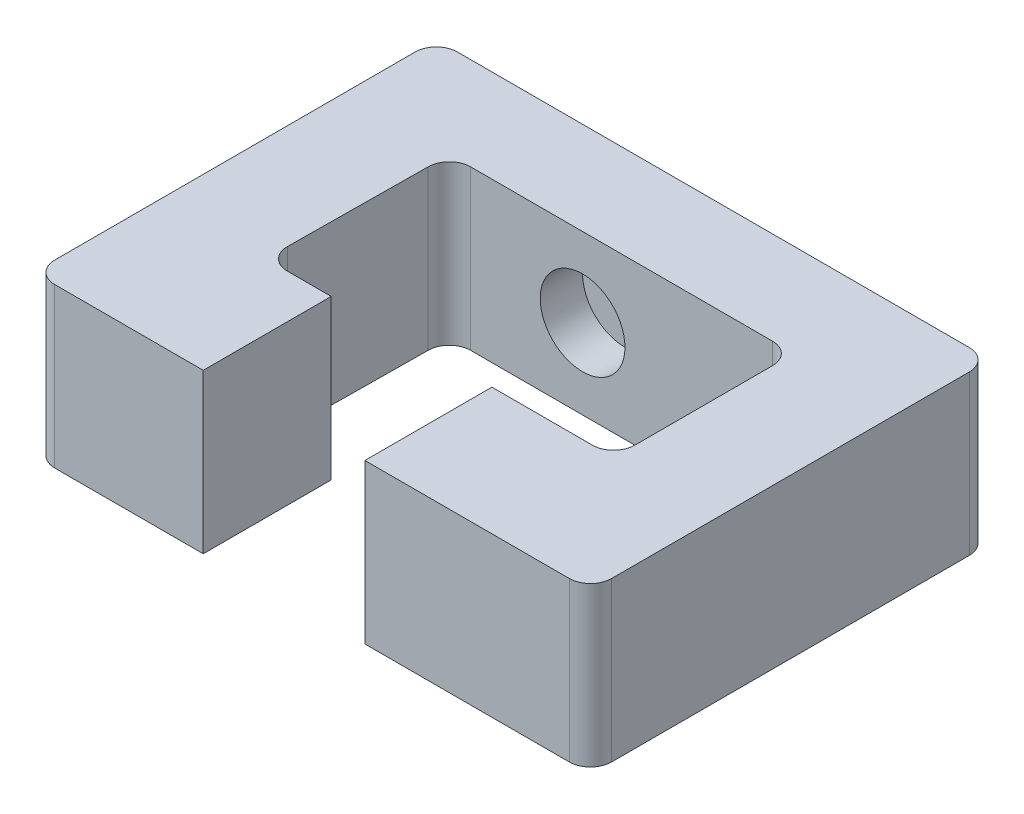
ISO-10303-21;
HEADER;
FILE_DESCRIPTION(('STEP AP214'),'2;1');
FILE_NAME('part.step','',(''),(''),'','','');
FILE_SCHEMA(('AUTOMOTIVE_DESIGN { 1 0 10303 214 1 1 1 1 }'));
ENDSEC;
DATA;
#1=APPLICATION_CONTEXT('core data for automotive mechanical design processes');
#2=APPLICATION_PROTOCOL_DEFINITION('international standard','automotive_design',2000,#1);
#3=PRODUCT_CONTEXT('',#1,'mechanical');
#4=PRODUCT('Part','Part','',(#3));
#5=PRODUCT_RELATED_PRODUCT_CATEGORY('part','',(#4));
#6=PRODUCT_DEFINITION_FORMATION('','',#4);
#7=PRODUCT_DEFINITION_CONTEXT('part definition',#1,'design');
#8=PRODUCT_DEFINITION('design','',#6,#7);
#9=PRODUCT_DEFINITION_SHAPE('','',#8);
#10=(LENGTH_UNIT() NAMED_UNIT(*) SI_UNIT(.MILLI.,.METRE.));
#11=(NAMED_UNIT(*) PLANE_ANGLE_UNIT() SI_UNIT($,.RADIAN.));
#12=(NAMED_UNIT(*) SI_UNIT($,.STERADIAN.) SOLID_ANGLE_UNIT());
#13=UNCERTAINTY_MEASURE_WITH_UNIT(LENGTH_MEASURE(1.E-05),#10,'distance_accuracy_value','');
#14=(GEOMETRIC_REPRESENTATION_CONTEXT(3) GLOBAL_UNCERTAINTY_ASSIGNED_CONTEXT((#13)) GLOBAL_UNIT_ASSIGNED_CONTEXT((#10,
#11,#12)) REPRESENTATION_CONTEXT('',''));
#15=CARTESIAN_POINT('',(0.,0.,0.));
#16=DIRECTION('',(0.,0.,1.));
#17=DIRECTION('',(1.,0.,0.));
#18=AXIS2_PLACEMENT_3D('',#15,#16,#17);
#19=CARTESIAN_POINT('',(11.2974538594039,15.,-15.5700064172726));
#20=DIRECTION('',(0.,-1.,0.));
#21=DIRECTION('',(0.,0.,-1.));
#22=AXIS2_PLACEMENT_3D('',#19,#20,#21);
#23=CYLINDRICAL_SURFACE('',#22,2.);
#24=CARTESIAN_POINT('',(11.2974538594039,0.,-15.5700064172726));
#25=DIRECTION('',(0.,1.,0.));
#26=DIRECTION('',(0.,0.,1.));
#27=AXIS2_PLACEMENT_3D('',#24,#25,#26);
#28=CIRCLE('',#27,2.);
#29=CARTESIAN_POINT('',(13.2974538594039,0.,-15.5700064172726));
#30=VERTEX_POINT('',#29);
#31=CARTESIAN_POINT('',(11.2974538594039,0.,-17.5700064172726));
#32=VERTEX_POINT('',#31);
#33=EDGE_CURVE('E205',#30,#32,#28,.T.);
#34=ORIENTED_EDGE('',*,*,#33,.T.);
#35=DIRECTION('',(0.,-1.,0.));
#36=VECTOR('',#35,1.);
#37=CARTESIAN_POINT('',(11.2974538594039,15.,-17.5700064172726));
#38=LINE('',#37,#36);
#39=CARTESIAN_POINT('',(11.2974538594039,15.,-17.5700064172726));
#40=VERTEX_POINT('',#39);
#41=EDGE_CURVE('E11',#40,#32,#38,.T.);
#42=ORIENTED_EDGE('',*,*,#41,.F.);
#43=CARTESIAN_POINT('',(11.2974538594039,15.,-15.5700064172726));
#44=DIRECTION('',(0.,1.,0.));
#45=DIRECTION('',(0.,0.,1.));
#46=AXIS2_PLACEMENT_3D('',#43,#44,#45);
#47=CIRCLE('',#46,2.);
#48=CARTESIAN_POINT('',(13.2974538594039,15.,-15.5700064172726));
#49=VERTEX_POINT('',#48);
#50=EDGE_CURVE('E245',#49,#40,#47,.T.);
#51=ORIENTED_EDGE('',*,*,#50,.F.);
#52=DIRECTION('',(0.,-1.,0.));
#53=VECTOR('',#52,1.);
#54=CARTESIAN_POINT('',(13.2974538594039,15.,-15.5700064172726));
#55=LINE('',#54,#53);
#56=EDGE_CURVE('E201',#49,#30,#55,.T.);
#57=ORIENTED_EDGE('',*,*,#56,.T.);
#58=EDGE_LOOP('',(#34,#42,#51,#57));
#59=FACE_BOUND('',#58,.T.);
#60=ADVANCED_FACE('F37',(#59),#23,.T.);
#61=CARTESIAN_POINT('',(-37.0074742804174,15.,-17.5700064172726));
#62=DIRECTION('',(0.,0.,1.));
#63=DIRECTION('',(1.,0.,0.));
#64=AXIS2_PLACEMENT_3D('',#61,#62,#63);
#65=PLANE('',#64);
#66=CARTESIAN_POINT('',(-16.3915105404779,7.58933574437393,-17.5700064172726));
#67=DIRECTION('',(0.,0.,1.));
#68=DIRECTION('',(1.,0.,0.));
#69=AXIS2_PLACEMENT_3D('',#66,#67,#68);
#70=CIRCLE('',#69,1.5);
#71=CARTESIAN_POINT('',(-14.8915105404779,7.58933574437393,-17.5700064172726));
#72=VERTEX_POINT('',#71);
#73=EDGE_CURVE('E40',#72,#72,#70,.T.);
#74=ORIENTED_EDGE('',*,*,#73,.T.);
#75=EDGE_LOOP('',(#74));
#76=FACE_BOUND('',#75,.T.);
#77=DIRECTION('',(-1.,0.,0.));
#78=VECTOR('',#77,1.);
#79=CARTESIAN_POINT('',(-37.0074742804174,0.,-17.5700064172726));
#80=LINE('',#79,#78);
#81=CARTESIAN_POINT('',(-37.0074742804174,0.,-17.5700064172726));
#82=VERTEX_POINT('',#81);
#83=EDGE_CURVE('E208',#32,#82,#80,.T.);
#84=ORIENTED_EDGE('',*,*,#83,.T.);
#85=DIRECTION('',(0.,-1.,0.));
#86=VECTOR('',#85,1.);
#87=CARTESIAN_POINT('',(-37.0074742804174,15.,-17.5700064172726));
#88=LINE('',#87,#86);
#89=CARTESIAN_POINT('',(-37.0074742804174,15.,-17.5700064172726));
#90=VERTEX_POINT('',#89);
#91=EDGE_CURVE('E46',#90,#82,#88,.T.);
#92=ORIENTED_EDGE('',*,*,#91,.F.);
#93=DIRECTION('',(-1.,0.,0.));
#94=VECTOR('',#93,1.);
#95=CARTESIAN_POINT('',(-37.0074742804174,15.,-17.5700064172726));
#96=LINE('',#95,#94);
#97=EDGE_CURVE('E133',#40,#90,#96,.T.);
#98=ORIENTED_EDGE('',*,*,#97,.F.);
#99=ORIENTED_EDGE('',*,*,#41,.T.);
#100=EDGE_LOOP('',(#84,#92,#98,#99));
#101=FACE_BOUND('',#100,.T.);
#102=ADVANCED_FACE('F365',(#76,#101),#65,.F.);
#103=CARTESIAN_POINT('',(-37.0074742804174,15.,-15.5700064172726));
#104=DIRECTION('',(0.,-1.,0.));
#105=DIRECTION('',(0.,0.,-1.));
#106=AXIS2_PLACEMENT_3D('',#103,#104,#105);
#107=CYLINDRICAL_SURFACE('',#106,2.);
#108=CARTESIAN_POINT('',(-37.0074742804174,0.,-15.5700064172726));
#109=DIRECTION('',(0.,1.,0.));
#110=DIRECTION('',(0.,0.,1.));
#111=AXIS2_PLACEMENT_3D('',#108,#109,#110);
#112=CIRCLE('',#111,2.);
#113=CARTESIAN_POINT('',(-39.0074742804174,0.,-15.5700064172726));
#114=VERTEX_POINT('',#113);
#115=EDGE_CURVE('E211',#82,#114,#112,.T.);
#116=ORIENTED_EDGE('',*,*,#115,.T.);
#117=DIRECTION('',(0.,-1.,0.));
#118=VECTOR('',#117,1.);
#119=CARTESIAN_POINT('',(-39.0074742804174,15.,-15.5700064172726));
#120=LINE('',#119,#118);
#121=CARTESIAN_POINT('',(-39.0074742804174,15.,-15.5700064172726));
#122=VERTEX_POINT('',#121);
#123=EDGE_CURVE('E288',#122,#114,#120,.T.);
#124=ORIENTED_EDGE('',*,*,#123,.F.);
#125=CARTESIAN_POINT('',(-37.0074742804174,15.,-15.5700064172726));
#126=DIRECTION('',(0.,1.,0.));
#127=DIRECTION('',(0.,0.,1.));
#128=AXIS2_PLACEMENT_3D('',#125,#126,#127);
#129=CIRCLE('',#128,2.);
#130=EDGE_CURVE('E297',#90,#122,#129,.T.);
#131=ORIENTED_EDGE('',*,*,#130,.F.);
#132=ORIENTED_EDGE('',*,*,#91,.T.);
#133=EDGE_LOOP('',(#116,#124,#131,#132));
#134=FACE_BOUND('',#133,.T.);
#135=ADVANCED_FACE('F295',(#134),#107,.T.);
#136=CARTESIAN_POINT('',(-39.0074742804174,15.,18.4405031752657));
#137=DIRECTION('',(1.,0.,0.));
#138=DIRECTION('',(0.,0.,-1.));
#139=AXIS2_PLACEMENT_3D('',#136,#137,#138);
#140=PLANE('',#139);
#141=DIRECTION('',(0.,0.,1.));
#142=VECTOR('',#141,1.);
#143=CARTESIAN_POINT('',(-39.0074742804174,0.,18.4405031752657));
#144=LINE('',#143,#142);
#145=CARTESIAN_POINT('',(-39.0074742804174,0.,18.4405031752657));
#146=VERTEX_POINT('',#145);
#147=EDGE_CURVE('E213',#114,#146,#144,.T.);
#148=ORIENTED_EDGE('',*,*,#147,.T.);
#149=DIRECTION('',(0.,-1.,0.));
#150=VECTOR('',#149,1.);
#151=CARTESIAN_POINT('',(-39.0074742804174,15.,18.4405031752657));
#152=LINE('',#151,#150);
#153=CARTESIAN_POINT('',(-39.0074742804174,15.,18.4405031752657));
#154=VERTEX_POINT('',#153);
#155=EDGE_CURVE('E285',#154,#146,#152,.T.);
#156=ORIENTED_EDGE('',*,*,#155,.F.);
#157=DIRECTION('',(0.,0.,1.));
#158=VECTOR('',#157,1.);
#159=CARTESIAN_POINT('',(-39.0074742804174,15.,18.4405031752657));
#160=LINE('',#159,#158);
#161=EDGE_CURVE('E315',#122,#154,#160,.T.);
#162=ORIENTED_EDGE('',*,*,#161,.F.);
#163=ORIENTED_EDGE('',*,*,#123,.T.);
#164=EDGE_LOOP('',(#148,#156,#162,#163));
#165=FACE_BOUND('',#164,.T.);
#166=ADVANCED_FACE('F306',(#165),#140,.F.);
#167=CARTESIAN_POINT('',(-37.0074742804174,15.,18.4405031752657));
#168=DIRECTION('',(0.,-1.,0.));
#169=DIRECTION('',(0.,0.,-1.));
#170=AXIS2_PLACEMENT_3D('',#167,#168,#169);
#171=CYLINDRICAL_SURFACE('',#170,2.);
#172=CARTESIAN_POINT('',(-37.0074742804174,0.,18.4405031752657));
#173=DIRECTION('',(0.,1.,0.));
#174=DIRECTION('',(0.,0.,1.));
#175=AXIS2_PLACEMENT_3D('',#172,#173,#174);
#176=CIRCLE('',#175,2.);
#177=CARTESIAN_POINT('',(-37.0074742804174,0.,20.4405031752657));
#178=VERTEX_POINT('',#177);
#179=EDGE_CURVE('E215',#146,#178,#176,.T.);
#180=ORIENTED_EDGE('',*,*,#179,.T.);
#181=DIRECTION('',(0.,-1.,0.));
#182=VECTOR('',#181,1.);
#183=CARTESIAN_POINT('',(-37.0074742804174,15.,20.4405031752657));
#184=LINE('',#183,#182);
#185=CARTESIAN_POINT('',(-37.0074742804174,15.,20.4405031752657));
#186=VERTEX_POINT('',#185);
#187=EDGE_CURVE('E282',#186,#178,#184,.T.);
#188=ORIENTED_EDGE('',*,*,#187,.F.);
#189=CARTESIAN_POINT('',(-37.0074742804174,15.,18.4405031752657));
#190=DIRECTION('',(0.,1.,0.));
#191=DIRECTION('',(0.,0.,1.));
#192=AXIS2_PLACEMENT_3D('',#189,#190,#191);
#193=CIRCLE('',#192,2.);
#194=EDGE_CURVE('E312',#154,#186,#193,.T.);
#195=ORIENTED_EDGE('',*,*,#194,.F.);
#196=ORIENTED_EDGE('',*,*,#155,.T.);
#197=EDGE_LOOP('',(#180,#188,#195,#196));
#198=FACE_BOUND('',#197,.T.);
#199=ADVANCED_FACE('F310',(#198),#171,.T.);
#200=CARTESIAN_POINT('',(-37.0074742804174,15.,20.4405031752657));
#201=DIRECTION('',(0.,0.,-1.));
#202=DIRECTION('',(-1.,0.,0.));
#203=AXIS2_PLACEMENT_3D('',#200,#201,#202);
#204=PLANE('',#203);
#205=DIRECTION('',(1.,0.,0.));
#206=VECTOR('',#205,1.);
#207=CARTESIAN_POINT('',(-37.0074742804174,0.,20.4405031752657));
#208=LINE('',#207,#206);
#209=CARTESIAN_POINT('',(-22.9901879310273,0.,20.4405031752657));
#210=VERTEX_POINT('',#209);
#211=EDGE_CURVE('E217',#178,#210,#208,.T.);
#212=ORIENTED_EDGE('',*,*,#211,.T.);
#213=DIRECTION('',(0.,-1.,0.));
#214=VECTOR('',#213,1.);
#215=CARTESIAN_POINT('',(-22.9901879310273,15.,20.4405031752657));
#216=LINE('',#215,#214);
#217=CARTESIAN_POINT('',(-22.9901879310273,15.,20.4405031752657));
#218=VERTEX_POINT('',#217);
#219=EDGE_CURVE('E279',#218,#210,#216,.T.);
#220=ORIENTED_EDGE('',*,*,#219,.F.);
#221=DIRECTION('',(1.,0.,0.));
#222=VECTOR('',#221,1.);
#223=CARTESIAN_POINT('',(-37.0074742804174,15.,20.4405031752657));
#224=LINE('',#223,#222);
#225=EDGE_CURVE('E314',#186,#218,#224,.T.);
#226=ORIENTED_EDGE('',*,*,#225,.F.);
#227=ORIENTED_EDGE('',*,*,#187,.T.);
#228=EDGE_LOOP('',(#212,#220,#226,#227));
#229=FACE_BOUND('',#228,.T.);
#230=ADVANCED_FACE('F380',(#229),#204,.F.);
#231=CARTESIAN_POINT('',(-22.9901879310273,15.,20.4405031752657));
#232=DIRECTION('',(-1.,0.,0.));
#233=DIRECTION('',(0.,0.,1.));
#234=AXIS2_PLACEMENT_3D('',#231,#232,#233);
#235=PLANE('',#234);
#236=DIRECTION('',(0.,0.,-1.));
#237=VECTOR('',#236,1.);
#238=CARTESIAN_POINT('',(-22.9901879310273,0.,20.4405031752657));
#239=LINE('',#238,#237);
#240=CARTESIAN_POINT('',(-22.9901879310273,0.,8.3671574678803));
#241=VERTEX_POINT('',#240);
#242=EDGE_CURVE('E219',#210,#241,#239,.T.);
#243=ORIENTED_EDGE('',*,*,#242,.T.);
#244=DIRECTION('',(0.,-1.,0.));
#245=VECTOR('',#244,1.);
#246=CARTESIAN_POINT('',(-22.9901879310273,15.,8.3671574678803));
#247=LINE('',#246,#245);
#248=CARTESIAN_POINT('',(-22.9901879310273,15.,8.3671574678803));
#249=VERTEX_POINT('',#248);
#250=EDGE_CURVE('E276',#249,#241,#247,.T.);
#251=ORIENTED_EDGE('',*,*,#250,.F.);
#252=DIRECTION('',(0.,0.,-1.));
#253=VECTOR('',#252,1.);
#254=CARTESIAN_POINT('',(-22.9901879310273,15.,20.4405031752657));
#255=LINE('',#254,#253);
#256=EDGE_CURVE('E317',#218,#249,#255,.T.);
#257=ORIENTED_EDGE('',*,*,#256,.F.);
#258=ORIENTED_EDGE('',*,*,#219,.T.);
#259=EDGE_LOOP('',(#243,#251,#257,#258));
#260=FACE_BOUND('',#259,.T.);
#261=ADVANCED_FACE('F383',(#260),#235,.F.);
#262=CARTESIAN_POINT('',(-22.9901879310273,15.,8.3671574678803));
#263=DIRECTION('',(0.,0.,1.));
#264=DIRECTION('',(1.,0.,0.));
#265=AXIS2_PLACEMENT_3D('',#262,#263,#264);
#266=PLANE('',#265);
#267=DIRECTION('',(-1.,0.,0.));
#268=VECTOR('',#267,1.);
#269=CARTESIAN_POINT('',(-22.9901879310273,0.,8.3671574678803));
#270=LINE('',#269,#268);
#271=CARTESIAN_POINT('',(-27.1321788100315,0.,8.3671574678803));
#272=VERTEX_POINT('',#271);
#273=EDGE_CURVE('E221',#241,#272,#270,.T.);
#274=ORIENTED_EDGE('',*,*,#273,.T.);
#275=DIRECTION('',(0.,-1.,0.));
#276=VECTOR('',#275,1.);
#277=CARTESIAN_POINT('',(-27.1321788100315,15.,8.3671574678803));
#278=LINE('',#277,#276);
#279=CARTESIAN_POINT('',(-27.1321788100315,15.,8.3671574678803));
#280=VERTEX_POINT('',#279);
#281=EDGE_CURVE('E273',#280,#272,#278,.T.);
#282=ORIENTED_EDGE('',*,*,#281,.F.);
#283=DIRECTION('',(-1.,0.,0.));
#284=VECTOR('',#283,1.);
#285=CARTESIAN_POINT('',(-22.9901879310273,15.,8.3671574678803));
#286=LINE('',#285,#284);
#287=EDGE_CURVE('E323',#249,#280,#286,.T.);
#288=ORIENTED_EDGE('',*,*,#287,.F.);
#289=ORIENTED_EDGE('',*,*,#250,.T.);
#290=EDGE_LOOP('',(#274,#282,#288,#289));
#291=FACE_BOUND('',#290,.T.);
#292=ADVANCED_FACE('F387',(#291),#266,.F.);
#293=CARTESIAN_POINT('',(-27.1321788100315,15.,6.3671574678803));
#294=DIRECTION('',(0.,-1.,0.));
#295=DIRECTION('',(0.,0.,-1.));
#296=AXIS2_PLACEMENT_3D('',#293,#294,#295);
#297=CYLINDRICAL_SURFACE('',#296,2.);
#298=CARTESIAN_POINT('',(-27.1321788100315,0.,6.3671574678803));
#299=DIRECTION('',(0.,-1.,0.));
#300=DIRECTION('',(0.,0.,1.));
#301=AXIS2_PLACEMENT_3D('',#298,#299,#300);
#302=CIRCLE('',#301,2.);
#303=CARTESIAN_POINT('',(-29.1320890626526,0.,6.34821066178533));
#304=VERTEX_POINT('',#303);
#305=EDGE_CURVE('E223',#272,#304,#302,.T.);
#306=ORIENTED_EDGE('',*,*,#305,.T.);
#307=DIRECTION('',(0.,-1.,0.));
#308=VECTOR('',#307,1.);
#309=CARTESIAN_POINT('',(-29.1320890626526,15.,6.34821066178533));
#310=LINE('',#309,#308);
#311=CARTESIAN_POINT('',(-29.1320890626526,15.,6.34821066178533));
#312=VERTEX_POINT('',#311);
#313=EDGE_CURVE('E270',#312,#304,#310,.T.);
#314=ORIENTED_EDGE('',*,*,#313,.F.);
#315=CARTESIAN_POINT('',(-27.1321788100315,15.,6.3671574678803));
#316=DIRECTION('',(0.,-1.,0.));
#317=DIRECTION('',(0.,0.,1.));
#318=AXIS2_PLACEMENT_3D('',#315,#316,#317);
#319=CIRCLE('',#318,2.);
#320=EDGE_CURVE('E325',#280,#312,#319,.T.);
#321=ORIENTED_EDGE('',*,*,#320,.F.);
#322=ORIENTED_EDGE('',*,*,#281,.T.);
#323=EDGE_LOOP('',(#306,#314,#321,#322));
#324=FACE_BOUND('',#323,.T.);
#325=ADVANCED_FACE('F391',(#324),#297,.F.);
#326=CARTESIAN_POINT('',(-29.1320890626526,15.,6.34821066178533));
#327=DIRECTION('',(-0.999955126310526,0.,-0.00947340304747817));
#328=DIRECTION('',(-0.00947340304747817,0.,0.999955126310526));
#329=AXIS2_PLACEMENT_3D('',#326,#327,#328);
#330=PLANE('',#329);
#331=DIRECTION('',(0.00947340304747817,0.,-0.999955126310526));
#332=VECTOR('',#331,1.);
#333=CARTESIAN_POINT('',(-29.1320890626526,0.,6.34821066178533));
#334=LINE('',#333,#332);
#335=CARTESIAN_POINT('',(-29.0074742804174,0.,-6.80537202498743));
#336=VERTEX_POINT('',#335);
#337=EDGE_CURVE('E225',#304,#336,#334,.T.);
#338=ORIENTED_EDGE('',*,*,#337,.T.);
#339=DIRECTION('',(0.,-1.,0.));
#340=VECTOR('',#339,1.);
#341=CARTESIAN_POINT('',(-29.0074742804174,15.,-6.80537202498743));
#342=LINE('',#341,#340);
#343=CARTESIAN_POINT('',(-29.0074742804174,15.,-6.80537202498743));
#344=VERTEX_POINT('',#343);
#345=EDGE_CURVE('E267',#344,#336,#342,.T.);
#346=ORIENTED_EDGE('',*,*,#345,.F.);
#347=DIRECTION('',(0.00947340304747817,0.,-0.999955126310526));
#348=VECTOR('',#347,1.);
#349=CARTESIAN_POINT('',(-29.1320890626526,15.,6.34821066178533));
#350=LINE('',#349,#348);
#351=EDGE_CURVE('E327',#312,#344,#350,.T.);
#352=ORIENTED_EDGE('',*,*,#351,.F.);
#353=ORIENTED_EDGE('',*,*,#313,.T.);
#354=EDGE_LOOP('',(#338,#346,#352,#353));
#355=FACE_BOUND('',#354,.T.);
#356=ADVANCED_FACE('F395',(#355),#330,.F.);
#357=CARTESIAN_POINT('',(-27.0074742804174,15.,-6.80537202498743));
#358=DIRECTION('',(0.,-1.,0.));
#359=DIRECTION('',(0.,0.,-1.));
#360=AXIS2_PLACEMENT_3D('',#357,#358,#359);
#361=CYLINDRICAL_SURFACE('',#360,2.);
#362=CARTESIAN_POINT('',(-27.0074742804174,0.,-6.80537202498743));
#363=DIRECTION('',(0.,-1.,0.));
#364=DIRECTION('',(0.,0.,1.));
#365=AXIS2_PLACEMENT_3D('',#362,#363,#364);
#366=CIRCLE('',#365,2.);
#367=CARTESIAN_POINT('',(-27.0074742804174,0.,-8.80537202498743));
#368=VERTEX_POINT('',#367);
#369=EDGE_CURVE('E227',#336,#368,#366,.T.);
#370=ORIENTED_EDGE('',*,*,#369,.T.);
#371=DIRECTION('',(0.,-1.,0.));
#372=VECTOR('',#371,1.);
#373=CARTESIAN_POINT('',(-27.0074742804174,15.,-8.80537202498743));
#374=LINE('',#373,#372);
#375=CARTESIAN_POINT('',(-27.0074742804174,15.,-8.80537202498743));
#376=VERTEX_POINT('',#375);
#377=EDGE_CURVE('E264',#376,#368,#374,.T.);
#378=ORIENTED_EDGE('',*,*,#377,.F.);
#379=CARTESIAN_POINT('',(-27.0074742804174,15.,-6.80537202498743));
#380=DIRECTION('',(0.,-1.,0.));
#381=DIRECTION('',(0.,0.,1.));
#382=AXIS2_PLACEMENT_3D('',#379,#380,#381);
#383=CIRCLE('',#382,2.);
#384=EDGE_CURVE('E329',#344,#376,#383,.T.);
#385=ORIENTED_EDGE('',*,*,#384,.F.);
#386=ORIENTED_EDGE('',*,*,#345,.T.);
#387=EDGE_LOOP('',(#370,#378,#385,#386));
#388=FACE_BOUND('',#387,.T.);
#389=ADVANCED_FACE('F399',(#388),#361,.F.);
#390=CARTESIAN_POINT('',(1.49757696179509,15.,-8.80537202498743));
#391=DIRECTION('',(0.,0.,-1.));
#392=DIRECTION('',(-1.,0.,0.));
#393=AXIS2_PLACEMENT_3D('',#390,#391,#392);
#394=PLANE('',#393);
#395=CARTESIAN_POINT('',(-16.4336745409273,7.53525201126237,-8.80537202498743));
#396=DIRECTION('',(0.,0.,1.));
#397=DIRECTION('',(1.,0.,0.));
#398=AXIS2_PLACEMENT_3D('',#395,#396,#397);
#399=CIRCLE('',#398,4.);
#400=CARTESIAN_POINT('',(-12.4336745409273,7.53525201126237,-8.80537202498743));
#401=VERTEX_POINT('',#400);
#402=EDGE_CURVE('E503',#401,#401,#399,.T.);
#403=ORIENTED_EDGE('',*,*,#402,.F.);
#404=EDGE_LOOP('',(#403));
#405=FACE_BOUND('',#404,.T.);
#406=DIRECTION('',(1.,0.,0.));
#407=VECTOR('',#406,1.);
#408=CARTESIAN_POINT('',(1.49757696179509,0.,-8.80537202498743));
#409=LINE('',#408,#407);
#410=CARTESIAN_POINT('',(1.49757696179509,0.,-8.80537202498743));
#411=VERTEX_POINT('',#410);
#412=EDGE_CURVE('E229',#368,#411,#409,.T.);
#413=ORIENTED_EDGE('',*,*,#412,.T.);
#414=DIRECTION('',(0.,-1.,0.));
#415=VECTOR('',#414,1.);
#416=CARTESIAN_POINT('',(1.49757696179509,15.,-8.80537202498743));
#417=LINE('',#416,#415);
#418=CARTESIAN_POINT('',(1.49757696179509,15.,-8.80537202498743));
#419=VERTEX_POINT('',#418);
#420=EDGE_CURVE('E261',#419,#411,#417,.T.);
#421=ORIENTED_EDGE('',*,*,#420,.F.);
#422=DIRECTION('',(1.,0.,0.));
#423=VECTOR('',#422,1.);
#424=CARTESIAN_POINT('',(1.49757696179509,15.,-8.80537202498743));
#425=LINE('',#424,#423);
#426=EDGE_CURVE('E331',#376,#419,#425,.T.);
#427=ORIENTED_EDGE('',*,*,#426,.F.);
#428=ORIENTED_EDGE('',*,*,#377,.T.);
#429=EDGE_LOOP('',(#413,#421,#427,#428));
#430=FACE_BOUND('',#429,.T.);
#431=ADVANCED_FACE('F403',(#405,#430),#394,.F.);
#432=CARTESIAN_POINT('',(1.49757696179509,15.,-6.80537202498743));
#433=DIRECTION('',(0.,-1.,0.));
#434=DIRECTION('',(0.,0.,-1.));
#435=AXIS2_PLACEMENT_3D('',#432,#433,#434);
#436=CYLINDRICAL_SURFACE('',#435,2.);
#437=CARTESIAN_POINT('',(1.49757696179509,0.,-6.80537202498743));
#438=DIRECTION('',(0.,-1.,0.));
#439=DIRECTION('',(0.,0.,-1.));
#440=AXIS2_PLACEMENT_3D('',#437,#438,#439);
#441=CIRCLE('',#440,2.);
#442=CARTESIAN_POINT('',(3.49757696179509,0.,-6.80537202498743));
#443=VERTEX_POINT('',#442);
#444=EDGE_CURVE('E231',#411,#443,#441,.T.);
#445=ORIENTED_EDGE('',*,*,#444,.T.);
#446=DIRECTION('',(0.,-1.,0.));
#447=VECTOR('',#446,1.);
#448=CARTESIAN_POINT('',(3.49757696179509,15.,-6.80537202498743));
#449=LINE('',#448,#447);
#450=CARTESIAN_POINT('',(3.49757696179509,15.,-6.80537202498743));
#451=VERTEX_POINT('',#450);
#452=EDGE_CURVE('E258',#451,#443,#449,.T.);
#453=ORIENTED_EDGE('',*,*,#452,.F.);
#454=CARTESIAN_POINT('',(1.49757696179509,15.,-6.80537202498743));
#455=DIRECTION('',(0.,-1.,0.));
#456=DIRECTION('',(0.,0.,-1.));
#457=AXIS2_PLACEMENT_3D('',#454,#455,#456);
#458=CIRCLE('',#457,2.);
#459=EDGE_CURVE('E333',#419,#451,#458,.T.);
#460=ORIENTED_EDGE('',*,*,#459,.F.);
#461=ORIENTED_EDGE('',*,*,#420,.T.);
#462=EDGE_LOOP('',(#445,#453,#460,#461));
#463=FACE_BOUND('',#462,.T.);
#464=ADVANCED_FACE('F407',(#463),#436,.F.);
#465=CARTESIAN_POINT('',(3.49757696179509,15.,-6.80537202498743));
#466=DIRECTION('',(1.,0.,0.));
#467=DIRECTION('',(0.,0.,-1.));
#468=AXIS2_PLACEMENT_3D('',#465,#466,#467);
#469=PLANE('',#468);
#470=DIRECTION('',(0.,0.,1.));
#471=VECTOR('',#470,1.);
#472=CARTESIAN_POINT('',(3.49757696179509,0.,-6.80537202498743));
#473=LINE('',#472,#471);
#474=CARTESIAN_POINT('',(3.49757696179509,0.,6.19668878614266));
#475=VERTEX_POINT('',#474);
#476=EDGE_CURVE('E233',#443,#475,#473,.T.);
#477=ORIENTED_EDGE('',*,*,#476,.T.);
#478=DIRECTION('',(0.,-1.,0.));
#479=VECTOR('',#478,1.);
#480=CARTESIAN_POINT('',(3.49757696179509,15.,6.19668878614266));
#481=LINE('',#480,#479);
#482=CARTESIAN_POINT('',(3.49757696179509,15.,6.19668878614266));
#483=VERTEX_POINT('',#482);
#484=EDGE_CURVE('E255',#483,#475,#481,.T.);
#485=ORIENTED_EDGE('',*,*,#484,.F.);
#486=DIRECTION('',(0.,0.,1.));
#487=VECTOR('',#486,1.);
#488=CARTESIAN_POINT('',(3.49757696179509,15.,-6.80537202498743));
#489=LINE('',#488,#487);
#490=EDGE_CURVE('E335',#451,#483,#489,.T.);
#491=ORIENTED_EDGE('',*,*,#490,.F.);
#492=ORIENTED_EDGE('',*,*,#452,.T.);
#493=EDGE_LOOP('',(#477,#485,#491,#492));
#494=FACE_BOUND('',#493,.T.);
#495=ADVANCED_FACE('F411',(#494),#469,.F.);
#496=CARTESIAN_POINT('',(1.49757696179509,15.,6.19668878614266));
#497=DIRECTION('',(0.,-1.,0.));
#498=DIRECTION('',(0.,0.,-1.));
#499=AXIS2_PLACEMENT_3D('',#496,#497,#498);
#500=CYLINDRICAL_SURFACE('',#499,2.);
#501=CARTESIAN_POINT('',(1.49757696179509,0.,6.19668878614266));
#502=DIRECTION('',(0.,-1.,0.));
#503=DIRECTION('',(0.,0.,-1.));
#504=AXIS2_PLACEMENT_3D('',#501,#502,#503);
#505=CIRCLE('',#504,2.);
#506=CARTESIAN_POINT('',(1.49757696179509,0.,8.19668878614266));
#507=VERTEX_POINT('',#506);
#508=EDGE_CURVE('E235',#475,#507,#505,.T.);
#509=ORIENTED_EDGE('',*,*,#508,.T.);
#510=DIRECTION('',(0.,-1.,0.));
#511=VECTOR('',#510,1.);
#512=CARTESIAN_POINT('',(1.49757696179509,15.,8.19668878614266));
#513=LINE('',#512,#511);
#514=CARTESIAN_POINT('',(1.49757696179509,15.,8.19668878614266));
#515=VERTEX_POINT('',#514);
#516=EDGE_CURVE('E252',#515,#507,#513,.T.);
#517=ORIENTED_EDGE('',*,*,#516,.F.);
#518=CARTESIAN_POINT('',(1.49757696179509,15.,6.19668878614266));
#519=DIRECTION('',(0.,-1.,0.));
#520=DIRECTION('',(0.,0.,-1.));
#521=AXIS2_PLACEMENT_3D('',#518,#519,#520);
#522=CIRCLE('',#521,2.);
#523=EDGE_CURVE('E337',#483,#515,#522,.T.);
#524=ORIENTED_EDGE('',*,*,#523,.F.);
#525=ORIENTED_EDGE('',*,*,#484,.T.);
#526=EDGE_LOOP('',(#509,#517,#524,#525));
#527=FACE_BOUND('',#526,.T.);
#528=ADVANCED_FACE('F415',(#527),#500,.F.);
#529=CARTESIAN_POINT('',(1.49757696179509,15.,8.19668878614266));
#530=DIRECTION('',(0.,0.,1.));
#531=DIRECTION('',(1.,0.,0.));
#532=AXIS2_PLACEMENT_3D('',#529,#530,#531);
#533=PLANE('',#532);
#534=DIRECTION('',(-1.,0.,0.));
#535=VECTOR('',#534,1.);
#536=CARTESIAN_POINT('',(1.49757696179509,0.,8.19668878614266));
#537=LINE('',#536,#535);
#538=CARTESIAN_POINT('',(-7.99018793102725,0.,8.19668878614266));
#539=VERTEX_POINT('',#538);
#540=EDGE_CURVE('E237',#507,#539,#537,.T.);
#541=ORIENTED_EDGE('',*,*,#540,.T.);
#542=DIRECTION('',(0.,-1.,0.));
#543=VECTOR('',#542,1.);
#544=CARTESIAN_POINT('',(-7.99018793102725,15.,8.19668878614266));
#545=LINE('',#544,#543);
#546=CARTESIAN_POINT('',(-7.99018793102725,15.,8.19668878614266));
#547=VERTEX_POINT('',#546);
#548=EDGE_CURVE('E249',#547,#539,#545,.T.);
#549=ORIENTED_EDGE('',*,*,#548,.F.);
#550=DIRECTION('',(-1.,0.,0.));
#551=VECTOR('',#550,1.);
#552=CARTESIAN_POINT('',(1.49757696179509,15.,8.19668878614266));
#553=LINE('',#552,#551);
#554=EDGE_CURVE('E339',#515,#547,#553,.T.);
#555=ORIENTED_EDGE('',*,*,#554,.F.);
#556=ORIENTED_EDGE('',*,*,#516,.T.);
#557=EDGE_LOOP('',(#541,#549,#555,#556));
#558=FACE_BOUND('',#557,.T.);
#559=ADVANCED_FACE('F345',(#558),#533,.F.);
#560=CARTESIAN_POINT('',(-7.99018793102725,15.,8.19668878614266));
#561=DIRECTION('',(1.,0.,0.));
#562=DIRECTION('',(0.,0.,-1.));
#563=AXIS2_PLACEMENT_3D('',#560,#561,#562);
#564=PLANE('',#563);
#565=DIRECTION('',(0.,0.,1.));
#566=VECTOR('',#565,1.);
#567=CARTESIAN_POINT('',(-7.99018793102725,0.,8.19668878614266));
#568=LINE('',#567,#566);
#569=CARTESIAN_POINT('',(-7.99018793102725,0.,20.1840708637846));
#570=VERTEX_POINT('',#569);
#571=EDGE_CURVE('E239',#539,#570,#568,.T.);
#572=ORIENTED_EDGE('',*,*,#571,.T.);
#573=DIRECTION('',(0.,-1.,0.));
#574=VECTOR('',#573,1.);
#575=CARTESIAN_POINT('',(-7.99018793102725,15.,20.1840708637846));
#576=LINE('',#575,#574);
#577=CARTESIAN_POINT('',(-7.99018793102725,15.,20.1840708637846));
#578=VERTEX_POINT('',#577);
#579=EDGE_CURVE('E196',#578,#570,#576,.T.);
#580=ORIENTED_EDGE('',*,*,#579,.F.);
#581=DIRECTION('',(0.,0.,1.));
#582=VECTOR('',#581,1.);
#583=CARTESIAN_POINT('',(-7.99018793102725,15.,8.19668878614266));
#584=LINE('',#583,#582);
#585=EDGE_CURVE('E188',#547,#578,#584,.T.);
#586=ORIENTED_EDGE('',*,*,#585,.F.);
#587=ORIENTED_EDGE('',*,*,#548,.T.);
#588=EDGE_LOOP('',(#572,#580,#586,#587));
#589=FACE_BOUND('',#588,.T.);
#590=ADVANCED_FACE('F349',(#589),#564,.F.);
#591=CARTESIAN_POINT('',(3.29745385940387,15.,20.1840708637846));
#592=DIRECTION('',(0.,0.,-1.));
#593=DIRECTION('',(-1.,0.,0.));
#594=AXIS2_PLACEMENT_3D('',#591,#592,#593);
#595=PLANE('',#594);
#596=DIRECTION('',(1.,0.,0.));
#597=VECTOR('',#596,1.);
#598=CARTESIAN_POINT('',(3.29745385940387,0.,20.1840708637846));
#599=LINE('',#598,#597);
#600=CARTESIAN_POINT('',(11.2974538594039,0.,20.1840708637846));
#601=VERTEX_POINT('',#600);
#602=EDGE_CURVE('E195',#570,#601,#599,.T.);
#603=ORIENTED_EDGE('',*,*,#602,.T.);
#604=DIRECTION('',(0.,-1.,0.));
#605=VECTOR('',#604,1.);
#606=CARTESIAN_POINT('',(11.2974538594039,15.,20.1840708637846));
#607=LINE('',#606,#605);
#608=CARTESIAN_POINT('',(11.2974538594039,15.,20.1840708637846));
#609=VERTEX_POINT('',#608);
#610=EDGE_CURVE('E193',#609,#601,#607,.T.);
#611=ORIENTED_EDGE('',*,*,#610,.F.);
#612=DIRECTION('',(1.,0.,0.));
#613=VECTOR('',#612,1.);
#614=CARTESIAN_POINT('',(-7.99018793102725,15.,20.1840708637846));
#615=LINE('',#614,#613);
#616=EDGE_CURVE('E182',#578,#609,#615,.T.);
#617=ORIENTED_EDGE('',*,*,#616,.F.);
#618=ORIENTED_EDGE('',*,*,#579,.T.);
#619=EDGE_LOOP('',(#603,#611,#617,#618));
#620=FACE_BOUND('',#619,.T.);
#621=ADVANCED_FACE('F194',(#620),#595,.F.);
#622=CARTESIAN_POINT('',(11.2974538594039,15.,18.1840708637846));
#623=DIRECTION('',(0.,-1.,0.));
#624=DIRECTION('',(0.,0.,-1.));
#625=AXIS2_PLACEMENT_3D('',#622,#623,#624);
#626=CYLINDRICAL_SURFACE('',#625,2.);
#627=CARTESIAN_POINT('',(11.2974538594039,0.,18.1840708637846));
#628=DIRECTION('',(0.,1.,0.));
#629=DIRECTION('',(0.,0.,-1.));
#630=AXIS2_PLACEMENT_3D('',#627,#628,#629);
#631=CIRCLE('',#630,2.);
#632=CARTESIAN_POINT('',(13.2974538594039,0.,18.1840708637846));
#633=VERTEX_POINT('',#632);
#634=EDGE_CURVE('E119',#601,#633,#631,.T.);
#635=ORIENTED_EDGE('',*,*,#634,.T.);
#636=DIRECTION('',(0.,-1.,0.));
#637=VECTOR('',#636,1.);
#638=CARTESIAN_POINT('',(13.2974538594039,15.,18.1840708637846));
#639=LINE('',#638,#637);
#640=CARTESIAN_POINT('',(13.2974538594039,15.,18.1840708637846));
#641=VERTEX_POINT('',#640);
#642=EDGE_CURVE('E197',#641,#633,#639,.T.);
#643=ORIENTED_EDGE('',*,*,#642,.F.);
#644=CARTESIAN_POINT('',(11.2974538594039,15.,18.1840708637846));
#645=DIRECTION('',(0.,1.,0.));
#646=DIRECTION('',(0.,0.,-1.));
#647=AXIS2_PLACEMENT_3D('',#644,#645,#646);
#648=CIRCLE('',#647,2.);
#649=EDGE_CURVE('E186',#609,#641,#648,.T.);
#650=ORIENTED_EDGE('',*,*,#649,.F.);
#651=ORIENTED_EDGE('',*,*,#610,.T.);
#652=EDGE_LOOP('',(#635,#643,#650,#651));
#653=FACE_BOUND('',#652,.T.);
#654=ADVANCED_FACE('F199',(#653),#626,.T.);
#655=CARTESIAN_POINT('',(13.2974538594039,15.,18.1840708637846));
#656=DIRECTION('',(-1.,0.,0.));
#657=DIRECTION('',(0.,0.,1.));
#658=AXIS2_PLACEMENT_3D('',#655,#656,#657);
#659=PLANE('',#658);
#660=DIRECTION('',(0.,0.,-1.));
#661=VECTOR('',#660,1.);
#662=CARTESIAN_POINT('',(13.2974538594039,0.,18.1840708637846));
#663=LINE('',#662,#661);
#664=EDGE_CURVE('E125',#633,#30,#663,.T.);
#665=ORIENTED_EDGE('',*,*,#664,.T.);
#666=ORIENTED_EDGE('',*,*,#56,.F.);
#667=DIRECTION('',(0.,0.,-1.));
#668=VECTOR('',#667,1.);
#669=CARTESIAN_POINT('',(13.2974538594039,15.,18.1840708637846));
#670=LINE('',#669,#668);
#671=EDGE_CURVE('E54',#641,#49,#670,.T.);
#672=ORIENTED_EDGE('',*,*,#671,.F.);
#673=ORIENTED_EDGE('',*,*,#642,.T.);
#674=EDGE_LOOP('',(#665,#666,#672,#673));
#675=FACE_BOUND('',#674,.T.);
#676=ADVANCED_FACE('F354',(#675),#659,.F.);
#677=CARTESIAN_POINT('',(11.2974538594039,15.,-15.5700064172726));
#678=DIRECTION('',(0.,1.,0.));
#679=DIRECTION('',(0.,0.,1.));
#680=AXIS2_PLACEMENT_3D('',#677,#678,#679);
#681=PLANE('',#680);
#682=ORIENTED_EDGE('',*,*,#50,.T.);
#683=ORIENTED_EDGE('',*,*,#97,.T.);
#684=ORIENTED_EDGE('',*,*,#130,.T.);
#685=ORIENTED_EDGE('',*,*,#161,.T.);
#686=ORIENTED_EDGE('',*,*,#194,.T.);
#687=ORIENTED_EDGE('',*,*,#225,.T.);
#688=ORIENTED_EDGE('',*,*,#256,.T.);
#689=ORIENTED_EDGE('',*,*,#287,.T.);
#690=ORIENTED_EDGE('',*,*,#320,.T.);
#691=ORIENTED_EDGE('',*,*,#351,.T.);
#692=ORIENTED_EDGE('',*,*,#384,.T.);
#693=ORIENTED_EDGE('',*,*,#426,.T.);
#694=ORIENTED_EDGE('',*,*,#459,.T.);
#695=ORIENTED_EDGE('',*,*,#490,.T.);
#696=ORIENTED_EDGE('',*,*,#523,.T.);
#697=ORIENTED_EDGE('',*,*,#554,.T.);
#698=ORIENTED_EDGE('',*,*,#585,.T.);
#699=ORIENTED_EDGE('',*,*,#616,.T.);
#700=ORIENTED_EDGE('',*,*,#649,.T.);
#701=ORIENTED_EDGE('',*,*,#671,.T.);
#702=EDGE_LOOP('',(#682,#683,#684,#685,#686,#687,#688,#689,#690,#691,#692,#693,#694,#695,#696,
#697,#698,#699,#700,#701));
#703=FACE_BOUND('',#702,.T.);
#704=ADVANCED_FACE('F184',(#703),#681,.T.);
#705=CARTESIAN_POINT('',(11.2974538594039,0.,-15.5700064172726));
#706=DIRECTION('',(0.,1.,0.));
#707=DIRECTION('',(0.,0.,1.));
#708=AXIS2_PLACEMENT_3D('',#705,#706,#707);
#709=PLANE('',#708);
#710=ORIENTED_EDGE('',*,*,#33,.F.);
#711=ORIENTED_EDGE('',*,*,#664,.F.);
#712=ORIENTED_EDGE('',*,*,#634,.F.);
#713=ORIENTED_EDGE('',*,*,#602,.F.);
#714=ORIENTED_EDGE('',*,*,#571,.F.);
#715=ORIENTED_EDGE('',*,*,#540,.F.);
#716=ORIENTED_EDGE('',*,*,#508,.F.);
#717=ORIENTED_EDGE('',*,*,#476,.F.);
#718=ORIENTED_EDGE('',*,*,#444,.F.);
#719=ORIENTED_EDGE('',*,*,#412,.F.);
#720=ORIENTED_EDGE('',*,*,#369,.F.);
#721=ORIENTED_EDGE('',*,*,#337,.F.);
#722=ORIENTED_EDGE('',*,*,#305,.F.);
#723=ORIENTED_EDGE('',*,*,#273,.F.);
#724=ORIENTED_EDGE('',*,*,#242,.F.);
#725=ORIENTED_EDGE('',*,*,#211,.F.);
#726=ORIENTED_EDGE('',*,*,#179,.F.);
#727=ORIENTED_EDGE('',*,*,#147,.F.);
#728=ORIENTED_EDGE('',*,*,#115,.F.);
#729=ORIENTED_EDGE('',*,*,#83,.F.);
#730=EDGE_LOOP('',(#710,#711,#712,#713,#714,#715,#716,#717,#718,#719,#720,#721,#722,#723,#724,
#725,#726,#727,#728,#729));
#731=FACE_BOUND('',#730,.T.);
#732=ADVANCED_FACE('F301',(#731),#709,.F.);
#733=CARTESIAN_POINT('',(-16.4336745409273,7.53525201126237,-12.8053720249874));
#734=DIRECTION('',(0.,0.,1.));
#735=DIRECTION('',(1.,0.,0.));
#736=AXIS2_PLACEMENT_3D('',#733,#734,#735);
#737=CYLINDRICAL_SURFACE('',#736,4.);
#738=CARTESIAN_POINT('',(-16.4336745409273,7.53525201126237,-12.8053720249874));
#739=DIRECTION('',(0.,0.,1.));
#740=DIRECTION('',(1.,0.,0.));
#741=AXIS2_PLACEMENT_3D('',#738,#739,#740);
#742=CIRCLE('',#741,4.);
#743=CARTESIAN_POINT('',(-12.4336745409273,7.53525201126237,-12.8053720249874));
#744=VERTEX_POINT('',#743);
#745=EDGE_CURVE('E209',#744,#744,#742,.T.);
#746=ORIENTED_EDGE('',*,*,#745,.F.);
#747=EDGE_LOOP('',(#746));
#748=FACE_BOUND('',#747,.T.);
#749=ORIENTED_EDGE('',*,*,#402,.T.);
#750=EDGE_LOOP('',(#749));
#751=FACE_BOUND('',#750,.T.);
#752=ADVANCED_FACE('F452',(#748,#751),#737,.F.);
#753=CARTESIAN_POINT('',(-16.4336745409273,7.53525201126237,-12.8053720249874));
#754=DIRECTION('',(0.,0.,1.));
#755=DIRECTION('',(1.,0.,0.));
#756=AXIS2_PLACEMENT_3D('',#753,#754,#755);
#757=PLANE('',#756);
#758=CARTESIAN_POINT('',(-16.3915105404779,7.58933574437393,-12.8053720249874));
#759=DIRECTION('',(0.,0.,1.));
#760=DIRECTION('',(1.,0.,0.));
#761=AXIS2_PLACEMENT_3D('',#758,#759,#760);
#762=CIRCLE('',#761,1.5);
#763=CARTESIAN_POINT('',(-14.8915105404779,7.58933574437393,-12.8053720249874));
#764=VERTEX_POINT('',#763);
#765=EDGE_CURVE('E501',#764,#764,#762,.T.);
#766=ORIENTED_EDGE('',*,*,#765,.F.);
#767=EDGE_LOOP('',(#766));
#768=FACE_BOUND('',#767,.T.);
#769=ORIENTED_EDGE('',*,*,#745,.T.);
#770=EDGE_LOOP('',(#769));
#771=FACE_BOUND('',#770,.T.);
#772=ADVANCED_FACE('F467',(#768,#771),#757,.T.);
#773=CARTESIAN_POINT('',(-16.3915105404779,7.58933574437393,-18.8053720249874));
#774=DIRECTION('',(0.,0.,1.));
#775=DIRECTION('',(1.,0.,0.));
#776=AXIS2_PLACEMENT_3D('',#773,#774,#775);
#777=CYLINDRICAL_SURFACE('',#776,1.5);
#778=ORIENTED_EDGE('',*,*,#765,.T.);
#779=EDGE_LOOP('',(#778));
#780=FACE_BOUND('',#779,.T.);
#781=ORIENTED_EDGE('',*,*,#73,.F.);
#782=EDGE_LOOP('',(#781));
#783=FACE_BOUND('',#782,.T.);
#784=ADVANCED_FACE('F484',(#780,#783),#777,.F.);
#785=CLOSED_SHELL('',(#60,#102,#135,#166,#199,#230,#261,#292,#325,#356,#389,#431,#464,#495,#528,
#559,#590,#621,#654,#676,#704,#732,#752,#772,#784));
#786=MANIFOLD_SOLID_BREP('B2',#785);
#787=ADVANCED_BREP_SHAPE_REPRESENTATION('',(#18,#786),#14);
#788=SHAPE_DEFINITION_REPRESENTATION(#9,#787);
ENDSEC;
END-ISO-10303-21;
